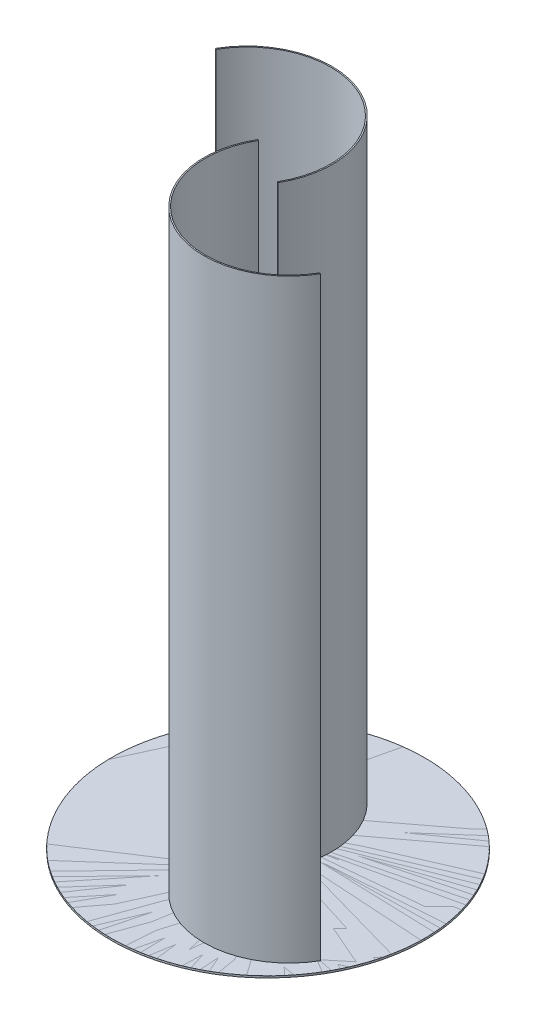
ISO-10303-21;
HEADER;
FILE_DESCRIPTION(('STEP AP214'),'2;1');
FILE_NAME('part.step','',(''),(''),'','','');
FILE_SCHEMA(('AUTOMOTIVE_DESIGN { 1 0 10303 214 1 1 1 1 }'));
ENDSEC;
DATA;
#1=APPLICATION_CONTEXT('core data for automotive mechanical design processes');
#2=APPLICATION_PROTOCOL_DEFINITION('international standard','automotive_design',2000,#1);
#3=PRODUCT_CONTEXT('',#1,'mechanical');
#4=PRODUCT('Part','Part','',(#3));
#5=PRODUCT_RELATED_PRODUCT_CATEGORY('part','',(#4));
#6=PRODUCT_DEFINITION_FORMATION('','',#4);
#7=PRODUCT_DEFINITION_CONTEXT('part definition',#1,'design');
#8=PRODUCT_DEFINITION('design','',#6,#7);
#9=PRODUCT_DEFINITION_SHAPE('','',#8);
#10=(LENGTH_UNIT() NAMED_UNIT(*) SI_UNIT(.MILLI.,.METRE.));
#11=(NAMED_UNIT(*) PLANE_ANGLE_UNIT() SI_UNIT($,.RADIAN.));
#12=(NAMED_UNIT(*) SI_UNIT($,.STERADIAN.) SOLID_ANGLE_UNIT());
#13=UNCERTAINTY_MEASURE_WITH_UNIT(LENGTH_MEASURE(1.E-05),#10,'distance_accuracy_value','');
#14=(GEOMETRIC_REPRESENTATION_CONTEXT(3) GLOBAL_UNCERTAINTY_ASSIGNED_CONTEXT((#13)) GLOBAL_UNIT_ASSIGNED_CONTEXT((#10,
#11,#12)) REPRESENTATION_CONTEXT('',''));
#15=CARTESIAN_POINT('',(0.,0.,0.));
#16=DIRECTION('',(0.,0.,1.));
#17=DIRECTION('',(1.,0.,0.));
#18=AXIS2_PLACEMENT_3D('',#15,#16,#17);
#19=CARTESIAN_POINT('',(0.,3.,0.));
#20=DIRECTION('',(0.,1.,0.));
#21=DIRECTION('',(0.,0.,-1.));
#22=AXIS2_PLACEMENT_3D('',#19,#20,#21);
#23=PLANE('',#22);
#24=CARTESIAN_POINT('',(0.,3.,0.));
#25=DIRECTION('',(0.,1.,0.));
#26=DIRECTION('',(0.,0.,-1.));
#27=AXIS2_PLACEMENT_3D('',#24,#25,#26);
#28=CIRCLE('',#27,250.);
#29=CARTESIAN_POINT('',(0.,3.,-250.));
#30=VERTEX_POINT('',#29);
#31=EDGE_CURVE('E12',#30,#30,#28,.T.);
#32=ORIENTED_EDGE('',*,*,#31,.T.);
#33=EDGE_LOOP('',(#32));
#34=FACE_BOUND('',#33,.T.);
#35=DIRECTION('',(-0.866025403784436,0.,-0.500000000000005));
#36=VECTOR('',#35,1.);
#37=CARTESIAN_POINT('',(197.689980809339,3.,114.136363636364));
#38=LINE('',#37,#36);
#39=CARTESIAN_POINT('',(197.689980809339,3.,114.136363636364));
#40=VERTEX_POINT('',#39);
#41=CARTESIAN_POINT('',(195.95793000177,3.,113.136363636364));
#42=VERTEX_POINT('',#41);
#43=EDGE_CURVE('E101',#40,#42,#38,.T.);
#44=ORIENTED_EDGE('',*,*,#43,.F.);
#45=CARTESIAN_POINT('',(79.910525894655,3.,46.1363636363638));
#46=DIRECTION('',(0.,1.,0.));
#47=DIRECTION('',(0.,0.,1.));
#48=AXIS2_PLACEMENT_3D('',#45,#46,#47);
#49=CIRCLE('',#48,136.);
#50=CARTESIAN_POINT('',(-37.8689290200286,3.,-21.8636363636364));
#51=VERTEX_POINT('',#50);
#52=EDGE_CURVE('E112',#51,#40,#49,.T.);
#53=ORIENTED_EDGE('',*,*,#52,.F.);
#54=DIRECTION('',(-0.866025403784438,0.,-0.500000000000001));
#55=VECTOR('',#54,1.);
#56=CARTESIAN_POINT('',(-36.1368782124597,3.,-20.8636363636364));
#57=LINE('',#56,#55);
#58=CARTESIAN_POINT('',(-36.1368782124597,3.,-20.8636363636363));
#59=VERTEX_POINT('',#58);
#60=EDGE_CURVE('E82',#59,#51,#57,.T.);
#61=ORIENTED_EDGE('',*,*,#60,.F.);
#62=CARTESIAN_POINT('',(79.910525894655,3.,46.1363636363638));
#63=DIRECTION('',(0.,-1.,0.));
#64=DIRECTION('',(0.,0.,1.));
#65=AXIS2_PLACEMENT_3D('',#62,#63,#64);
#66=CIRCLE('',#65,134.);
#67=EDGE_CURVE('E116',#42,#59,#66,.T.);
#68=ORIENTED_EDGE('',*,*,#67,.F.);
#69=EDGE_LOOP('',(#44,#53,#61,#68));
#70=FACE_BOUND('',#69,.T.);
#71=ADVANCED_FACE('F45',(#34,#70),#23,.T.);
#72=CARTESIAN_POINT('',(0.,3.,0.));
#73=DIRECTION('',(0.,-1.,0.));
#74=DIRECTION('',(0.,0.,1.));
#75=AXIS2_PLACEMENT_3D('',#72,#73,#74);
#76=CYLINDRICAL_SURFACE('',#75,250.);
#77=ORIENTED_EDGE('',*,*,#31,.F.);
#78=EDGE_LOOP('',(#77));
#79=FACE_BOUND('',#78,.T.);
#80=CARTESIAN_POINT('',(0.,0.,0.));
#81=DIRECTION('',(0.,1.,0.));
#82=DIRECTION('',(0.,0.,-1.));
#83=AXIS2_PLACEMENT_3D('',#80,#81,#82);
#84=CIRCLE('',#83,250.);
#85=CARTESIAN_POINT('',(0.,0.,-250.));
#86=VERTEX_POINT('',#85);
#87=EDGE_CURVE('E49',#86,#86,#84,.T.);
#88=ORIENTED_EDGE('',*,*,#87,.T.);
#89=EDGE_LOOP('',(#88));
#90=FACE_BOUND('',#89,.T.);
#91=ADVANCED_FACE('F47',(#79,#90),#76,.T.);
#92=CARTESIAN_POINT('',(0.,0.,0.));
#93=DIRECTION('',(0.,1.,0.));
#94=DIRECTION('',(0.,0.,-1.));
#95=AXIS2_PLACEMENT_3D('',#92,#93,#94);
#96=PLANE('',#95);
#97=ORIENTED_EDGE('',*,*,#87,.F.);
#98=EDGE_LOOP('',(#97));
#99=FACE_BOUND('',#98,.T.);
#100=ADVANCED_FACE('F125',(#99),#96,.F.);
#101=CARTESIAN_POINT('',(79.910525894655,953.,46.1363636363638));
#102=DIRECTION('',(0.,-1.,0.));
#103=DIRECTION('',(0.,0.,1.));
#104=AXIS2_PLACEMENT_3D('',#101,#102,#103);
#105=CYLINDRICAL_SURFACE('',#104,136.);
#106=ORIENTED_EDGE('',*,*,#52,.T.);
#107=DIRECTION('',(0.,-1.,0.));
#108=VECTOR('',#107,1.);
#109=CARTESIAN_POINT('',(197.689980809339,953.,114.136363636364));
#110=LINE('',#109,#108);
#111=CARTESIAN_POINT('',(197.689980809339,953.,114.136363636364));
#112=VERTEX_POINT('',#111);
#113=EDGE_CURVE('E104',#112,#40,#110,.T.);
#114=ORIENTED_EDGE('',*,*,#113,.F.);
#115=CARTESIAN_POINT('',(79.910525894655,953.,46.1363636363638));
#116=DIRECTION('',(0.,1.,0.));
#117=DIRECTION('',(0.,0.,1.));
#118=AXIS2_PLACEMENT_3D('',#115,#116,#117);
#119=CIRCLE('',#118,136.);
#120=CARTESIAN_POINT('',(-37.8689290200286,953.,-21.8636363636364));
#121=VERTEX_POINT('',#120);
#122=EDGE_CURVE('E94',#121,#112,#119,.T.);
#123=ORIENTED_EDGE('',*,*,#122,.F.);
#124=DIRECTION('',(0.,-1.,0.));
#125=VECTOR('',#124,1.);
#126=CARTESIAN_POINT('',(-37.8689290200286,953.,-21.8636363636364));
#127=LINE('',#126,#125);
#128=EDGE_CURVE('E108',#121,#51,#127,.T.);
#129=ORIENTED_EDGE('',*,*,#128,.T.);
#130=EDGE_LOOP('',(#106,#114,#123,#129));
#131=FACE_BOUND('',#130,.T.);
#132=ADVANCED_FACE('F127',(#131),#105,.T.);
#133=CARTESIAN_POINT('',(197.689980809339,953.,114.136363636364));
#134=DIRECTION('',(-0.500000000000005,0.,0.866025403784436));
#135=DIRECTION('',(0.866025403784436,0.,0.500000000000005));
#136=AXIS2_PLACEMENT_3D('',#133,#134,#135);
#137=PLANE('',#136);
#138=ORIENTED_EDGE('',*,*,#43,.T.);
#139=DIRECTION('',(0.,-1.,0.));
#140=VECTOR('',#139,1.);
#141=CARTESIAN_POINT('',(195.95793000177,953.,113.136363636364));
#142=LINE('',#141,#140);
#143=CARTESIAN_POINT('',(195.95793000177,953.,113.136363636364));
#144=VERTEX_POINT('',#143);
#145=EDGE_CURVE('E98',#144,#42,#142,.T.);
#146=ORIENTED_EDGE('',*,*,#145,.F.);
#147=DIRECTION('',(-0.866025403784436,0.,-0.500000000000005));
#148=VECTOR('',#147,1.);
#149=CARTESIAN_POINT('',(197.689980809339,953.,114.136363636364));
#150=LINE('',#149,#148);
#151=EDGE_CURVE('E89',#112,#144,#150,.T.);
#152=ORIENTED_EDGE('',*,*,#151,.F.);
#153=ORIENTED_EDGE('',*,*,#113,.T.);
#154=EDGE_LOOP('',(#138,#146,#152,#153));
#155=FACE_BOUND('',#154,.T.);
#156=ADVANCED_FACE('F99',(#155),#137,.F.);
#157=CARTESIAN_POINT('',(79.910525894655,953.,46.1363636363638));
#158=DIRECTION('',(0.,-1.,0.));
#159=DIRECTION('',(0.,0.,1.));
#160=AXIS2_PLACEMENT_3D('',#157,#158,#159);
#161=CYLINDRICAL_SURFACE('',#160,134.);
#162=ORIENTED_EDGE('',*,*,#67,.T.);
#163=DIRECTION('',(0.,-1.,0.));
#164=VECTOR('',#163,1.);
#165=CARTESIAN_POINT('',(-36.1368782124597,953.,-20.8636363636364));
#166=LINE('',#165,#164);
#167=CARTESIAN_POINT('',(-36.1368782124597,953.,-20.8636363636364));
#168=VERTEX_POINT('',#167);
#169=EDGE_CURVE('E60',#168,#59,#166,.T.);
#170=ORIENTED_EDGE('',*,*,#169,.F.);
#171=CARTESIAN_POINT('',(79.910525894655,953.,46.1363636363638));
#172=DIRECTION('',(0.,-1.,0.));
#173=DIRECTION('',(0.,0.,1.));
#174=AXIS2_PLACEMENT_3D('',#171,#172,#173);
#175=CIRCLE('',#174,134.);
#176=EDGE_CURVE('E92',#144,#168,#175,.T.);
#177=ORIENTED_EDGE('',*,*,#176,.F.);
#178=ORIENTED_EDGE('',*,*,#145,.T.);
#179=EDGE_LOOP('',(#162,#170,#177,#178));
#180=FACE_BOUND('',#179,.T.);
#181=ADVANCED_FACE('F106',(#180),#161,.F.);
#182=CARTESIAN_POINT('',(-36.1368782124597,953.,-20.8636363636364));
#183=DIRECTION('',(-0.500000000000001,0.,0.866025403784438));
#184=DIRECTION('',(0.866025403784438,0.,0.500000000000001));
#185=AXIS2_PLACEMENT_3D('',#182,#183,#184);
#186=PLANE('',#185);
#187=ORIENTED_EDGE('',*,*,#60,.T.);
#188=ORIENTED_EDGE('',*,*,#128,.F.);
#189=DIRECTION('',(-0.866025403784438,0.,-0.500000000000001));
#190=VECTOR('',#189,1.);
#191=CARTESIAN_POINT('',(-36.1368782124597,953.,-20.8636363636364));
#192=LINE('',#191,#190);
#193=EDGE_CURVE('E68',#168,#121,#192,.T.);
#194=ORIENTED_EDGE('',*,*,#193,.F.);
#195=ORIENTED_EDGE('',*,*,#169,.T.);
#196=EDGE_LOOP('',(#187,#188,#194,#195));
#197=FACE_BOUND('',#196,.T.);
#198=ADVANCED_FACE('F146',(#197),#186,.F.);
#199=CARTESIAN_POINT('',(79.910525894655,953.,46.1363636363638));
#200=DIRECTION('',(0.,-1.,0.));
#201=DIRECTION('',(0.,0.,1.));
#202=AXIS2_PLACEMENT_3D('',#199,#200,#201);
#203=PLANE('',#202);
#204=ORIENTED_EDGE('',*,*,#122,.T.);
#205=ORIENTED_EDGE('',*,*,#151,.T.);
#206=ORIENTED_EDGE('',*,*,#176,.T.);
#207=ORIENTED_EDGE('',*,*,#193,.T.);
#208=EDGE_LOOP('',(#204,#205,#206,#207));
#209=FACE_BOUND('',#208,.T.);
#210=ADVANCED_FACE('F90',(#209),#203,.F.);
#211=CLOSED_SHELL('',(#71,#91,#100,#132,#156,#181,#198,#210));
#212=MANIFOLD_SOLID_BREP('B2',#211);
#213=CARTESIAN_POINT('',(0.,3.,0.));
#214=DIRECTION('',(0.,1.,0.));
#215=DIRECTION('',(0.,0.,1.));
#216=AXIS2_PLACEMENT_3D('',#213,#214,#215);
#217=PLANE('',#216);
#218=CARTESIAN_POINT('',(0.,3.,0.));
#219=DIRECTION('',(0.,1.,0.));
#220=DIRECTION('',(0.,0.,1.));
#221=AXIS2_PLACEMENT_3D('',#218,#219,#220);
#222=CIRCLE('',#221,250.);
#223=CARTESIAN_POINT('',(0.,3.,250.));
#224=VERTEX_POINT('',#223);
#225=EDGE_CURVE('E43',#224,#224,#222,.T.);
#226=ORIENTED_EDGE('',*,*,#225,.T.);
#227=EDGE_LOOP('',(#226));
#228=FACE_BOUND('',#227,.T.);
#229=DIRECTION('',(0.866025403784436,0.,0.500000000000005));
#230=VECTOR('',#229,1.);
#231=CARTESIAN_POINT('',(-197.689980809339,3.,-114.136363636364));
#232=LINE('',#231,#230);
#233=CARTESIAN_POINT('',(-197.689980809339,3.,-114.136363636364));
#234=VERTEX_POINT('',#233);
#235=CARTESIAN_POINT('',(-195.95793000177,3.,-113.136363636364));
#236=VERTEX_POINT('',#235);
#237=EDGE_CURVE('E255',#234,#236,#232,.T.);
#238=ORIENTED_EDGE('',*,*,#237,.F.);
#239=CARTESIAN_POINT('',(-79.910525894655,3.,-46.1363636363638));
#240=DIRECTION('',(0.,1.,0.));
#241=DIRECTION('',(0.,0.,-1.));
#242=AXIS2_PLACEMENT_3D('',#239,#240,#241);
#243=CIRCLE('',#242,136.);
#244=CARTESIAN_POINT('',(37.8689290200286,3.,21.8636363636364));
#245=VERTEX_POINT('',#244);
#246=EDGE_CURVE('E266',#245,#234,#243,.T.);
#247=ORIENTED_EDGE('',*,*,#246,.F.);
#248=DIRECTION('',(0.866025403784438,0.,0.500000000000001));
#249=VECTOR('',#248,1.);
#250=CARTESIAN_POINT('',(36.1368782124597,3.,20.8636363636364));
#251=LINE('',#250,#249);
#252=CARTESIAN_POINT('',(36.1368782124597,3.,20.8636363636363));
#253=VERTEX_POINT('',#252);
#254=EDGE_CURVE('E236',#253,#245,#251,.T.);
#255=ORIENTED_EDGE('',*,*,#254,.F.);
#256=CARTESIAN_POINT('',(-79.910525894655,3.,-46.1363636363638));
#257=DIRECTION('',(0.,-1.,0.));
#258=DIRECTION('',(0.,0.,-1.));
#259=AXIS2_PLACEMENT_3D('',#256,#257,#258);
#260=CIRCLE('',#259,134.);
#261=EDGE_CURVE('E270',#236,#253,#260,.T.);
#262=ORIENTED_EDGE('',*,*,#261,.F.);
#263=EDGE_LOOP('',(#238,#247,#255,#262));
#264=FACE_BOUND('',#263,.T.);
#265=ADVANCED_FACE('F199',(#228,#264),#217,.T.);
#266=CARTESIAN_POINT('',(0.,3.,0.));
#267=DIRECTION('',(0.,-1.,0.));
#268=DIRECTION('',(0.,0.,-1.));
#269=AXIS2_PLACEMENT_3D('',#266,#267,#268);
#270=CYLINDRICAL_SURFACE('',#269,250.);
#271=ORIENTED_EDGE('',*,*,#225,.F.);
#272=EDGE_LOOP('',(#271));
#273=FACE_BOUND('',#272,.T.);
#274=CARTESIAN_POINT('',(0.,0.,0.));
#275=DIRECTION('',(0.,1.,0.));
#276=DIRECTION('',(0.,0.,1.));
#277=AXIS2_PLACEMENT_3D('',#274,#275,#276);
#278=CIRCLE('',#277,250.);
#279=CARTESIAN_POINT('',(0.,0.,250.));
#280=VERTEX_POINT('',#279);
#281=EDGE_CURVE('E203',#280,#280,#278,.T.);
#282=ORIENTED_EDGE('',*,*,#281,.T.);
#283=EDGE_LOOP('',(#282));
#284=FACE_BOUND('',#283,.T.);
#285=ADVANCED_FACE('F201',(#273,#284),#270,.T.);
#286=CARTESIAN_POINT('',(0.,0.,0.));
#287=DIRECTION('',(0.,1.,0.));
#288=DIRECTION('',(0.,0.,1.));
#289=AXIS2_PLACEMENT_3D('',#286,#287,#288);
#290=PLANE('',#289);
#291=ORIENTED_EDGE('',*,*,#281,.F.);
#292=EDGE_LOOP('',(#291));
#293=FACE_BOUND('',#292,.T.);
#294=ADVANCED_FACE('F279',(#293),#290,.F.);
#295=CARTESIAN_POINT('',(-79.910525894655,953.,-46.1363636363638));
#296=DIRECTION('',(0.,-1.,0.));
#297=DIRECTION('',(0.,0.,-1.));
#298=AXIS2_PLACEMENT_3D('',#295,#296,#297);
#299=CYLINDRICAL_SURFACE('',#298,136.);
#300=ORIENTED_EDGE('',*,*,#246,.T.);
#301=DIRECTION('',(0.,-1.,0.));
#302=VECTOR('',#301,1.);
#303=CARTESIAN_POINT('',(-197.689980809339,953.,-114.136363636364));
#304=LINE('',#303,#302);
#305=CARTESIAN_POINT('',(-197.689980809339,953.,-114.136363636364));
#306=VERTEX_POINT('',#305);
#307=EDGE_CURVE('E258',#306,#234,#304,.T.);
#308=ORIENTED_EDGE('',*,*,#307,.F.);
#309=CARTESIAN_POINT('',(-79.910525894655,953.,-46.1363636363638));
#310=DIRECTION('',(0.,1.,0.));
#311=DIRECTION('',(0.,0.,-1.));
#312=AXIS2_PLACEMENT_3D('',#309,#310,#311);
#313=CIRCLE('',#312,136.);
#314=CARTESIAN_POINT('',(37.8689290200286,953.,21.8636363636364));
#315=VERTEX_POINT('',#314);
#316=EDGE_CURVE('E248',#315,#306,#313,.T.);
#317=ORIENTED_EDGE('',*,*,#316,.F.);
#318=DIRECTION('',(0.,-1.,0.));
#319=VECTOR('',#318,1.);
#320=CARTESIAN_POINT('',(37.8689290200286,953.,21.8636363636364));
#321=LINE('',#320,#319);
#322=EDGE_CURVE('E262',#315,#245,#321,.T.);
#323=ORIENTED_EDGE('',*,*,#322,.T.);
#324=EDGE_LOOP('',(#300,#308,#317,#323));
#325=FACE_BOUND('',#324,.T.);
#326=ADVANCED_FACE('F281',(#325),#299,.T.);
#327=CARTESIAN_POINT('',(-197.689980809339,953.,-114.136363636364));
#328=DIRECTION('',(0.500000000000005,0.,-0.866025403784436));
#329=DIRECTION('',(-0.866025403784436,0.,-0.500000000000005));
#330=AXIS2_PLACEMENT_3D('',#327,#328,#329);
#331=PLANE('',#330);
#332=ORIENTED_EDGE('',*,*,#237,.T.);
#333=DIRECTION('',(0.,-1.,0.));
#334=VECTOR('',#333,1.);
#335=CARTESIAN_POINT('',(-195.95793000177,953.,-113.136363636364));
#336=LINE('',#335,#334);
#337=CARTESIAN_POINT('',(-195.95793000177,953.,-113.136363636364));
#338=VERTEX_POINT('',#337);
#339=EDGE_CURVE('E252',#338,#236,#336,.T.);
#340=ORIENTED_EDGE('',*,*,#339,.F.);
#341=DIRECTION('',(0.866025403784436,0.,0.500000000000005));
#342=VECTOR('',#341,1.);
#343=CARTESIAN_POINT('',(-197.689980809339,953.,-114.136363636364));
#344=LINE('',#343,#342);
#345=EDGE_CURVE('E243',#306,#338,#344,.T.);
#346=ORIENTED_EDGE('',*,*,#345,.F.);
#347=ORIENTED_EDGE('',*,*,#307,.T.);
#348=EDGE_LOOP('',(#332,#340,#346,#347));
#349=FACE_BOUND('',#348,.T.);
#350=ADVANCED_FACE('F253',(#349),#331,.F.);
#351=CARTESIAN_POINT('',(-79.910525894655,953.,-46.1363636363638));
#352=DIRECTION('',(0.,-1.,0.));
#353=DIRECTION('',(0.,0.,-1.));
#354=AXIS2_PLACEMENT_3D('',#351,#352,#353);
#355=CYLINDRICAL_SURFACE('',#354,134.);
#356=ORIENTED_EDGE('',*,*,#261,.T.);
#357=DIRECTION('',(0.,-1.,0.));
#358=VECTOR('',#357,1.);
#359=CARTESIAN_POINT('',(36.1368782124597,953.,20.8636363636364));
#360=LINE('',#359,#358);
#361=CARTESIAN_POINT('',(36.1368782124597,953.,20.8636363636364));
#362=VERTEX_POINT('',#361);
#363=EDGE_CURVE('E214',#362,#253,#360,.T.);
#364=ORIENTED_EDGE('',*,*,#363,.F.);
#365=CARTESIAN_POINT('',(-79.910525894655,953.,-46.1363636363638));
#366=DIRECTION('',(0.,-1.,0.));
#367=DIRECTION('',(0.,0.,-1.));
#368=AXIS2_PLACEMENT_3D('',#365,#366,#367);
#369=CIRCLE('',#368,134.);
#370=EDGE_CURVE('E246',#338,#362,#369,.T.);
#371=ORIENTED_EDGE('',*,*,#370,.F.);
#372=ORIENTED_EDGE('',*,*,#339,.T.);
#373=EDGE_LOOP('',(#356,#364,#371,#372));
#374=FACE_BOUND('',#373,.T.);
#375=ADVANCED_FACE('F260',(#374),#355,.F.);
#376=CARTESIAN_POINT('',(36.1368782124597,953.,20.8636363636364));
#377=DIRECTION('',(0.500000000000001,0.,-0.866025403784438));
#378=DIRECTION('',(-0.866025403784438,0.,-0.500000000000001));
#379=AXIS2_PLACEMENT_3D('',#376,#377,#378);
#380=PLANE('',#379);
#381=ORIENTED_EDGE('',*,*,#254,.T.);
#382=ORIENTED_EDGE('',*,*,#322,.F.);
#383=DIRECTION('',(0.866025403784438,0.,0.500000000000001));
#384=VECTOR('',#383,1.);
#385=CARTESIAN_POINT('',(36.1368782124597,953.,20.8636363636364));
#386=LINE('',#385,#384);
#387=EDGE_CURVE('E222',#362,#315,#386,.T.);
#388=ORIENTED_EDGE('',*,*,#387,.F.);
#389=ORIENTED_EDGE('',*,*,#363,.T.);
#390=EDGE_LOOP('',(#381,#382,#388,#389));
#391=FACE_BOUND('',#390,.T.);
#392=ADVANCED_FACE('F300',(#391),#380,.F.);
#393=CARTESIAN_POINT('',(-79.910525894655,953.,-46.1363636363638));
#394=DIRECTION('',(0.,-1.,0.));
#395=DIRECTION('',(0.,0.,-1.));
#396=AXIS2_PLACEMENT_3D('',#393,#394,#395);
#397=PLANE('',#396);
#398=ORIENTED_EDGE('',*,*,#316,.T.);
#399=ORIENTED_EDGE('',*,*,#345,.T.);
#400=ORIENTED_EDGE('',*,*,#370,.T.);
#401=ORIENTED_EDGE('',*,*,#387,.T.);
#402=EDGE_LOOP('',(#398,#399,#400,#401));
#403=FACE_BOUND('',#402,.T.);
#404=ADVANCED_FACE('F244',(#403),#397,.F.);
#405=CLOSED_SHELL('',(#265,#285,#294,#326,#350,#375,#392,#404));
#406=MANIFOLD_SOLID_BREP('B6',#405);
#407=ADVANCED_BREP_SHAPE_REPRESENTATION('',(#18,#212,#406),#14);
#408=SHAPE_DEFINITION_REPRESENTATION(#9,#407);
ENDSEC;
END-ISO-10303-21;
